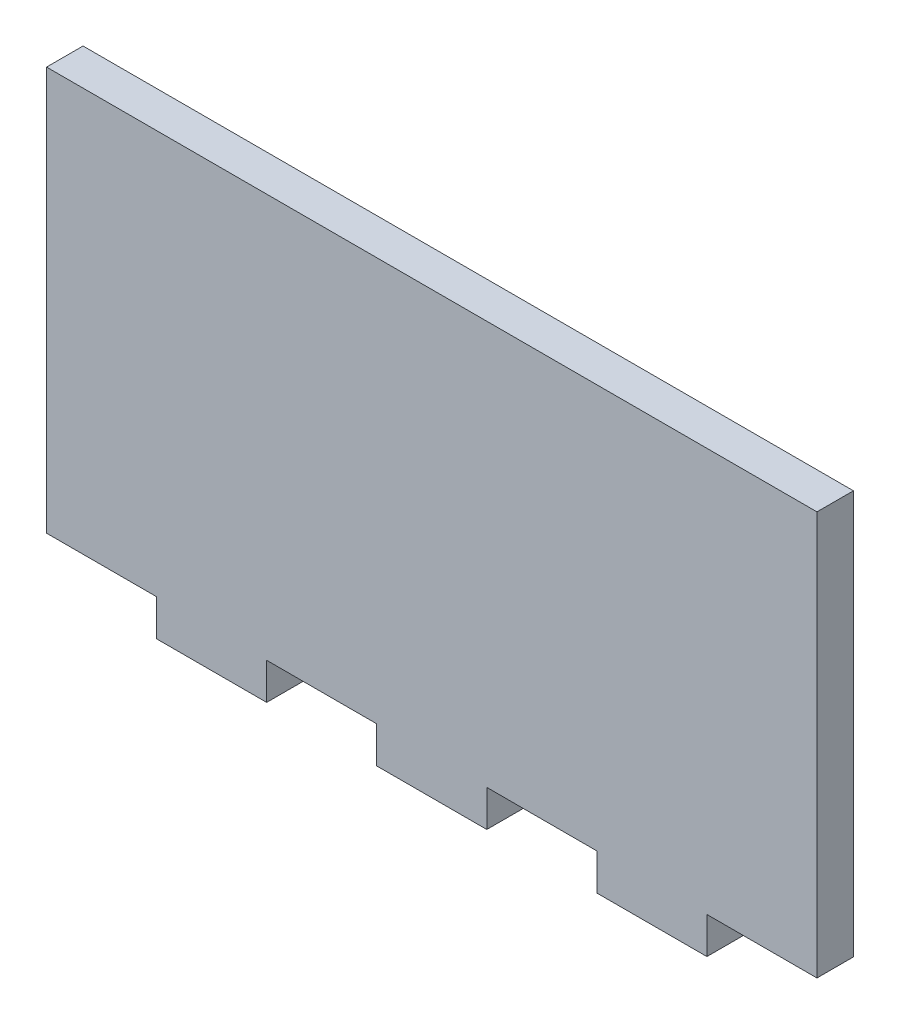
ISO-10303-21;
HEADER;
FILE_DESCRIPTION(('STEP AP214'),'2;1');
FILE_NAME('part.step','',(''),(''),'','','');
FILE_SCHEMA(('AUTOMOTIVE_DESIGN { 1 0 10303 214 1 1 1 1 }'));
ENDSEC;
DATA;
#1=APPLICATION_CONTEXT('core data for automotive mechanical design processes');
#2=APPLICATION_PROTOCOL_DEFINITION('international standard','automotive_design',2000,#1);
#3=PRODUCT_CONTEXT('',#1,'mechanical');
#4=PRODUCT('Part','Part','',(#3));
#5=PRODUCT_RELATED_PRODUCT_CATEGORY('part','',(#4));
#6=PRODUCT_DEFINITION_FORMATION('','',#4);
#7=PRODUCT_DEFINITION_CONTEXT('part definition',#1,'design');
#8=PRODUCT_DEFINITION('design','',#6,#7);
#9=PRODUCT_DEFINITION_SHAPE('','',#8);
#10=(LENGTH_UNIT() NAMED_UNIT(*) SI_UNIT(.MILLI.,.METRE.));
#11=(NAMED_UNIT(*) PLANE_ANGLE_UNIT() SI_UNIT($,.RADIAN.));
#12=(NAMED_UNIT(*) SI_UNIT($,.STERADIAN.) SOLID_ANGLE_UNIT());
#13=UNCERTAINTY_MEASURE_WITH_UNIT(LENGTH_MEASURE(1.E-05),#10,'distance_accuracy_value','');
#14=(GEOMETRIC_REPRESENTATION_CONTEXT(3) GLOBAL_UNCERTAINTY_ASSIGNED_CONTEXT((#13)) GLOBAL_UNIT_ASSIGNED_CONTEXT((#10,
#11,#12)) REPRESENTATION_CONTEXT('',''));
#15=CARTESIAN_POINT('',(0.,0.,0.));
#16=DIRECTION('',(0.,0.,1.));
#17=DIRECTION('',(1.,0.,0.));
#18=AXIS2_PLACEMENT_3D('',#15,#16,#17);
#19=CARTESIAN_POINT('',(0.,0.,3.175));
#20=DIRECTION('',(0.,1.,0.));
#21=DIRECTION('',(-1.,0.,0.));
#22=AXIS2_PLACEMENT_3D('',#19,#20,#21);
#23=PLANE('',#22);
#24=DIRECTION('',(0.,0.,1.));
#25=VECTOR('',#24,1.);
#26=CARTESIAN_POINT('',(-9.57942857142856,0.,0.));
#27=LINE('',#26,#25);
#28=CARTESIAN_POINT('',(-9.57942857142856,0.,0.));
#29=VERTEX_POINT('',#28);
#30=CARTESIAN_POINT('',(-9.57942857142856,0.,3.175));
#31=VERTEX_POINT('',#30);
#32=EDGE_CURVE('E161',#29,#31,#27,.T.);
#33=ORIENTED_EDGE('',*,*,#32,.F.);
#34=DIRECTION('',(1.,0.,0.));
#35=VECTOR('',#34,1.);
#36=CARTESIAN_POINT('',(0.,0.,0.));
#37=LINE('',#36,#35);
#38=CARTESIAN_POINT('',(0.,0.,0.));
#39=VERTEX_POINT('',#38);
#40=EDGE_CURVE('E148',#29,#39,#37,.T.);
#41=ORIENTED_EDGE('',*,*,#40,.T.);
#42=DIRECTION('',(0.,0.,-1.));
#43=VECTOR('',#42,1.);
#44=CARTESIAN_POINT('',(0.,0.,3.175));
#45=LINE('',#44,#43);
#46=CARTESIAN_POINT('',(0.,0.,3.175));
#47=VERTEX_POINT('',#46);
#48=EDGE_CURVE('E248',#47,#39,#45,.T.);
#49=ORIENTED_EDGE('',*,*,#48,.F.);
#50=DIRECTION('',(1.,0.,0.));
#51=VECTOR('',#50,1.);
#52=CARTESIAN_POINT('',(0.,0.,3.175));
#53=LINE('',#52,#51);
#54=EDGE_CURVE('E50',#31,#47,#53,.T.);
#55=ORIENTED_EDGE('',*,*,#54,.F.);
#56=EDGE_LOOP('',(#33,#41,#49,#55));
#57=FACE_BOUND('',#56,.T.);
#58=ADVANCED_FACE('F35',(#57),#23,.F.);
#59=DIRECTION('',(0.,0.,1.));
#60=VECTOR('',#59,1.);
#61=CARTESIAN_POINT('',(-19.1588571428571,0.,0.));
#62=LINE('',#61,#60);
#63=CARTESIAN_POINT('',(-19.1588571428571,0.,0.));
#64=VERTEX_POINT('',#63);
#65=CARTESIAN_POINT('',(-19.1588571428571,0.,3.175));
#66=VERTEX_POINT('',#65);
#67=EDGE_CURVE('E58',#64,#66,#62,.T.);
#68=ORIENTED_EDGE('',*,*,#67,.T.);
#69=CARTESIAN_POINT('',(-28.7382857142857,0.,3.175));
#70=VERTEX_POINT('',#69);
#71=EDGE_CURVE('E451',#70,#66,#53,.T.);
#72=ORIENTED_EDGE('',*,*,#71,.F.);
#73=DIRECTION('',(0.,0.,1.));
#74=VECTOR('',#73,1.);
#75=CARTESIAN_POINT('',(-28.7382857142857,0.,0.));
#76=LINE('',#75,#74);
#77=CARTESIAN_POINT('',(-28.7382857142857,0.,0.));
#78=VERTEX_POINT('',#77);
#79=EDGE_CURVE('E198',#78,#70,#76,.T.);
#80=ORIENTED_EDGE('',*,*,#79,.F.);
#81=EDGE_CURVE('E157',#78,#64,#37,.T.);
#82=ORIENTED_EDGE('',*,*,#81,.T.);
#83=EDGE_LOOP('',(#68,#72,#80,#82));
#84=FACE_BOUND('',#83,.T.);
#85=ADVANCED_FACE('F288',(#84),#23,.F.);
#86=DIRECTION('',(0.,0.,1.));
#87=VECTOR('',#86,1.);
#88=CARTESIAN_POINT('',(-38.3177142857143,0.,0.));
#89=LINE('',#88,#87);
#90=CARTESIAN_POINT('',(-38.3177142857143,0.,0.));
#91=VERTEX_POINT('',#90);
#92=CARTESIAN_POINT('',(-38.3177142857143,0.,3.175));
#93=VERTEX_POINT('',#92);
#94=EDGE_CURVE('E211',#91,#93,#89,.T.);
#95=ORIENTED_EDGE('',*,*,#94,.T.);
#96=CARTESIAN_POINT('',(-47.8971428571428,0.,3.175));
#97=VERTEX_POINT('',#96);
#98=EDGE_CURVE('E249',#97,#93,#53,.T.);
#99=ORIENTED_EDGE('',*,*,#98,.F.);
#100=DIRECTION('',(0.,0.,1.));
#101=VECTOR('',#100,1.);
#102=CARTESIAN_POINT('',(-47.8971428571428,0.,0.));
#103=LINE('',#102,#101);
#104=CARTESIAN_POINT('',(-47.8971428571428,0.,0.));
#105=VERTEX_POINT('',#104);
#106=EDGE_CURVE('E223',#105,#97,#103,.T.);
#107=ORIENTED_EDGE('',*,*,#106,.F.);
#108=EDGE_CURVE('E255',#105,#91,#37,.T.);
#109=ORIENTED_EDGE('',*,*,#108,.T.);
#110=EDGE_LOOP('',(#95,#99,#107,#109));
#111=FACE_BOUND('',#110,.T.);
#112=ADVANCED_FACE('F283',(#111),#23,.F.);
#113=CARTESIAN_POINT('',(0.,0.,3.175));
#114=DIRECTION('',(-1.,0.,0.));
#115=DIRECTION('',(0.,0.,1.));
#116=AXIS2_PLACEMENT_3D('',#113,#114,#115);
#117=PLANE('',#116);
#118=DIRECTION('',(0.,1.,0.));
#119=VECTOR('',#118,1.);
#120=CARTESIAN_POINT('',(0.,0.,0.));
#121=LINE('',#120,#119);
#122=CARTESIAN_POINT('',(0.,35.13836,0.));
#123=VERTEX_POINT('',#122);
#124=EDGE_CURVE('E155',#39,#123,#121,.T.);
#125=ORIENTED_EDGE('',*,*,#124,.T.);
#126=DIRECTION('',(0.,0.,-1.));
#127=VECTOR('',#126,1.);
#128=CARTESIAN_POINT('',(0.,35.13836,3.175));
#129=LINE('',#128,#127);
#130=CARTESIAN_POINT('',(0.,35.13836,3.175));
#131=VERTEX_POINT('',#130);
#132=EDGE_CURVE('E11',#131,#123,#129,.T.);
#133=ORIENTED_EDGE('',*,*,#132,.F.);
#134=DIRECTION('',(0.,1.,0.));
#135=VECTOR('',#134,1.);
#136=CARTESIAN_POINT('',(0.,0.,3.175));
#137=LINE('',#136,#135);
#138=EDGE_CURVE('E238',#47,#131,#137,.T.);
#139=ORIENTED_EDGE('',*,*,#138,.F.);
#140=ORIENTED_EDGE('',*,*,#48,.T.);
#141=EDGE_LOOP('',(#125,#133,#139,#140));
#142=FACE_BOUND('',#141,.T.);
#143=ADVANCED_FACE('F37',(#142),#117,.F.);
#144=CARTESIAN_POINT('',(0.,35.13836,3.175));
#145=DIRECTION('',(0.,-1.,0.));
#146=DIRECTION('',(1.,0.,0.));
#147=AXIS2_PLACEMENT_3D('',#144,#145,#146);
#148=PLANE('',#147);
#149=DIRECTION('',(-1.,0.,0.));
#150=VECTOR('',#149,1.);
#151=CARTESIAN_POINT('',(0.,35.13836,0.));
#152=LINE('',#151,#150);
#153=CARTESIAN_POINT('',(-67.056,35.13836,0.));
#154=VERTEX_POINT('',#153);
#155=EDGE_CURVE('E251',#123,#154,#152,.T.);
#156=ORIENTED_EDGE('',*,*,#155,.T.);
#157=DIRECTION('',(0.,0.,-1.));
#158=VECTOR('',#157,1.);
#159=CARTESIAN_POINT('',(-67.056,35.13836,3.175));
#160=LINE('',#159,#158);
#161=CARTESIAN_POINT('',(-67.056,35.13836,3.175));
#162=VERTEX_POINT('',#161);
#163=EDGE_CURVE('E43',#162,#154,#160,.T.);
#164=ORIENTED_EDGE('',*,*,#163,.F.);
#165=DIRECTION('',(-1.,0.,0.));
#166=VECTOR('',#165,1.);
#167=CARTESIAN_POINT('',(0.,35.13836,3.175));
#168=LINE('',#167,#166);
#169=EDGE_CURVE('E241',#131,#162,#168,.T.);
#170=ORIENTED_EDGE('',*,*,#169,.F.);
#171=ORIENTED_EDGE('',*,*,#132,.T.);
#172=EDGE_LOOP('',(#156,#164,#170,#171));
#173=FACE_BOUND('',#172,.T.);
#174=ADVANCED_FACE('F280',(#173),#148,.F.);
#175=CARTESIAN_POINT('',(-67.056,0.,3.175));
#176=DIRECTION('',(1.,0.,0.));
#177=DIRECTION('',(0.,0.,-1.));
#178=AXIS2_PLACEMENT_3D('',#175,#176,#177);
#179=PLANE('',#178);
#180=DIRECTION('',(0.,-1.,0.));
#181=VECTOR('',#180,1.);
#182=CARTESIAN_POINT('',(-67.056,0.,0.));
#183=LINE('',#182,#181);
#184=CARTESIAN_POINT('',(-67.056,0.,0.));
#185=VERTEX_POINT('',#184);
#186=EDGE_CURVE('E158',#154,#185,#183,.T.);
#187=ORIENTED_EDGE('',*,*,#186,.T.);
#188=DIRECTION('',(0.,0.,-1.));
#189=VECTOR('',#188,1.);
#190=CARTESIAN_POINT('',(-67.056,0.,3.175));
#191=LINE('',#190,#189);
#192=CARTESIAN_POINT('',(-67.056,0.,3.175));
#193=VERTEX_POINT('',#192);
#194=EDGE_CURVE('E257',#193,#185,#191,.T.);
#195=ORIENTED_EDGE('',*,*,#194,.F.);
#196=DIRECTION('',(0.,-1.,0.));
#197=VECTOR('',#196,1.);
#198=CARTESIAN_POINT('',(-67.056,0.,3.175));
#199=LINE('',#198,#197);
#200=EDGE_CURVE('E243',#162,#193,#199,.T.);
#201=ORIENTED_EDGE('',*,*,#200,.F.);
#202=ORIENTED_EDGE('',*,*,#163,.T.);
#203=EDGE_LOOP('',(#187,#195,#201,#202));
#204=FACE_BOUND('',#203,.T.);
#205=ADVANCED_FACE('F264',(#204),#179,.F.);
#206=CARTESIAN_POINT('',(-57.4765714285714,0.,0.));
#207=VERTEX_POINT('',#206);
#208=EDGE_CURVE('E160',#185,#207,#37,.T.);
#209=ORIENTED_EDGE('',*,*,#208,.T.);
#210=DIRECTION('',(0.,0.,1.));
#211=VECTOR('',#210,1.);
#212=CARTESIAN_POINT('',(-57.4765714285714,0.,0.));
#213=LINE('',#212,#211);
#214=CARTESIAN_POINT('',(-57.4765714285714,0.,3.175));
#215=VERTEX_POINT('',#214);
#216=EDGE_CURVE('E234',#207,#215,#213,.T.);
#217=ORIENTED_EDGE('',*,*,#216,.T.);
#218=EDGE_CURVE('E245',#193,#215,#53,.T.);
#219=ORIENTED_EDGE('',*,*,#218,.F.);
#220=ORIENTED_EDGE('',*,*,#194,.T.);
#221=EDGE_LOOP('',(#209,#217,#219,#220));
#222=FACE_BOUND('',#221,.T.);
#223=ADVANCED_FACE('F272',(#222),#23,.F.);
#224=CARTESIAN_POINT('',(0.,0.,3.175));
#225=DIRECTION('',(0.,0.,1.));
#226=DIRECTION('',(1.,0.,0.));
#227=AXIS2_PLACEMENT_3D('',#224,#225,#226);
#228=PLANE('',#227);
#229=ORIENTED_EDGE('',*,*,#138,.T.);
#230=ORIENTED_EDGE('',*,*,#169,.T.);
#231=ORIENTED_EDGE('',*,*,#200,.T.);
#232=ORIENTED_EDGE('',*,*,#218,.T.);
#233=DIRECTION('',(0.,1.,0.));
#234=VECTOR('',#233,1.);
#235=CARTESIAN_POINT('',(-57.4765714285714,0.,3.175));
#236=LINE('',#235,#234);
#237=CARTESIAN_POINT('',(-57.4765714285714,-3.175,3.175));
#238=VERTEX_POINT('',#237);
#239=EDGE_CURVE('E226',#238,#215,#236,.T.);
#240=ORIENTED_EDGE('',*,*,#239,.F.);
#241=DIRECTION('',(1.,0.,0.));
#242=VECTOR('',#241,1.);
#243=CARTESIAN_POINT('',(0.,-3.17499999999999,3.175));
#244=LINE('',#243,#242);
#245=CARTESIAN_POINT('',(-47.8971428571428,-3.175,3.175));
#246=VERTEX_POINT('',#245);
#247=EDGE_CURVE('E218',#238,#246,#244,.T.);
#248=ORIENTED_EDGE('',*,*,#247,.T.);
#249=DIRECTION('',(0.,-1.,0.));
#250=VECTOR('',#249,1.);
#251=CARTESIAN_POINT('',(-47.8971428571428,0.,3.175));
#252=LINE('',#251,#250);
#253=EDGE_CURVE('E208',#97,#246,#252,.T.);
#254=ORIENTED_EDGE('',*,*,#253,.F.);
#255=ORIENTED_EDGE('',*,*,#98,.T.);
#256=DIRECTION('',(0.,1.,0.));
#257=VECTOR('',#256,1.);
#258=CARTESIAN_POINT('',(-38.3177142857143,0.,3.175));
#259=LINE('',#258,#257);
#260=CARTESIAN_POINT('',(-38.3177142857143,-3.175,3.175));
#261=VERTEX_POINT('',#260);
#262=EDGE_CURVE('E201',#261,#93,#259,.T.);
#263=ORIENTED_EDGE('',*,*,#262,.F.);
#264=DIRECTION('',(1.,0.,0.));
#265=VECTOR('',#264,1.);
#266=CARTESIAN_POINT('',(19.1588571428571,-3.17499999999999,3.175));
#267=LINE('',#266,#265);
#268=CARTESIAN_POINT('',(-28.7382857142857,-3.175,3.175));
#269=VERTEX_POINT('',#268);
#270=EDGE_CURVE('E192',#261,#269,#267,.T.);
#271=ORIENTED_EDGE('',*,*,#270,.T.);
#272=DIRECTION('',(0.,-1.,0.));
#273=VECTOR('',#272,1.);
#274=CARTESIAN_POINT('',(-28.7382857142857,0.,3.175));
#275=LINE('',#274,#273);
#276=EDGE_CURVE('E185',#70,#269,#275,.T.);
#277=ORIENTED_EDGE('',*,*,#276,.F.);
#278=ORIENTED_EDGE('',*,*,#71,.T.);
#279=DIRECTION('',(0.,1.,0.));
#280=VECTOR('',#279,1.);
#281=CARTESIAN_POINT('',(-19.1588571428571,0.,3.175));
#282=LINE('',#281,#280);
#283=CARTESIAN_POINT('',(-19.1588571428571,-3.175,3.175));
#284=VERTEX_POINT('',#283);
#285=EDGE_CURVE('E176',#284,#66,#282,.T.);
#286=ORIENTED_EDGE('',*,*,#285,.F.);
#287=DIRECTION('',(1.,0.,0.));
#288=VECTOR('',#287,1.);
#289=CARTESIAN_POINT('',(38.3177142857143,-3.17499999999999,3.175));
#290=LINE('',#289,#288);
#291=CARTESIAN_POINT('',(-9.57942857142856,-3.175,3.175));
#292=VERTEX_POINT('',#291);
#293=EDGE_CURVE('E171',#284,#292,#290,.T.);
#294=ORIENTED_EDGE('',*,*,#293,.T.);
#295=DIRECTION('',(0.,-1.,0.));
#296=VECTOR('',#295,1.);
#297=CARTESIAN_POINT('',(-9.57942857142856,0.,3.175));
#298=LINE('',#297,#296);
#299=EDGE_CURVE('E180',#31,#292,#298,.T.);
#300=ORIENTED_EDGE('',*,*,#299,.F.);
#301=ORIENTED_EDGE('',*,*,#54,.T.);
#302=EDGE_LOOP('',(#229,#230,#231,#232,#240,#248,#254,#255,#263,#271,#277,#278,#286,#294,#300,#301));
#303=FACE_BOUND('',#302,.T.);
#304=ADVANCED_FACE('F276',(#303),#228,.T.);
#305=CARTESIAN_POINT('',(0.,0.,0.));
#306=DIRECTION('',(0.,0.,1.));
#307=DIRECTION('',(1.,0.,0.));
#308=AXIS2_PLACEMENT_3D('',#305,#306,#307);
#309=PLANE('',#308);
#310=ORIENTED_EDGE('',*,*,#124,.F.);
#311=ORIENTED_EDGE('',*,*,#40,.F.);
#312=DIRECTION('',(0.,-1.,0.));
#313=VECTOR('',#312,1.);
#314=CARTESIAN_POINT('',(-9.57942857142856,0.,0.));
#315=LINE('',#314,#313);
#316=CARTESIAN_POINT('',(-9.57942857142856,-3.175,0.));
#317=VERTEX_POINT('',#316);
#318=EDGE_CURVE('E152',#29,#317,#315,.T.);
#319=ORIENTED_EDGE('',*,*,#318,.T.);
#320=DIRECTION('',(1.,0.,0.));
#321=VECTOR('',#320,1.);
#322=CARTESIAN_POINT('',(38.3177142857143,-3.17499999999999,0.));
#323=LINE('',#322,#321);
#324=CARTESIAN_POINT('',(-19.1588571428571,-3.175,0.));
#325=VERTEX_POINT('',#324);
#326=EDGE_CURVE('E165',#325,#317,#323,.T.);
#327=ORIENTED_EDGE('',*,*,#326,.F.);
#328=DIRECTION('',(0.,1.,0.));
#329=VECTOR('',#328,1.);
#330=CARTESIAN_POINT('',(-19.1588571428571,0.,0.));
#331=LINE('',#330,#329);
#332=EDGE_CURVE('E170',#325,#64,#331,.T.);
#333=ORIENTED_EDGE('',*,*,#332,.T.);
#334=ORIENTED_EDGE('',*,*,#81,.F.);
#335=DIRECTION('',(0.,-1.,0.));
#336=VECTOR('',#335,1.);
#337=CARTESIAN_POINT('',(-28.7382857142857,0.,0.));
#338=LINE('',#337,#336);
#339=CARTESIAN_POINT('',(-28.7382857142857,-3.175,0.));
#340=VERTEX_POINT('',#339);
#341=EDGE_CURVE('E189',#78,#340,#338,.T.);
#342=ORIENTED_EDGE('',*,*,#341,.T.);
#343=DIRECTION('',(1.,0.,0.));
#344=VECTOR('',#343,1.);
#345=CARTESIAN_POINT('',(19.1588571428571,-3.17499999999999,0.));
#346=LINE('',#345,#344);
#347=CARTESIAN_POINT('',(-38.3177142857143,-3.175,0.));
#348=VERTEX_POINT('',#347);
#349=EDGE_CURVE('E195',#348,#340,#346,.T.);
#350=ORIENTED_EDGE('',*,*,#349,.F.);
#351=DIRECTION('',(0.,1.,0.));
#352=VECTOR('',#351,1.);
#353=CARTESIAN_POINT('',(-38.3177142857143,0.,0.));
#354=LINE('',#353,#352);
#355=EDGE_CURVE('E191',#348,#91,#354,.T.);
#356=ORIENTED_EDGE('',*,*,#355,.T.);
#357=ORIENTED_EDGE('',*,*,#108,.F.);
#358=DIRECTION('',(0.,-1.,0.));
#359=VECTOR('',#358,1.);
#360=CARTESIAN_POINT('',(-47.8971428571428,0.,0.));
#361=LINE('',#360,#359);
#362=CARTESIAN_POINT('',(-47.8971428571428,-3.175,0.));
#363=VERTEX_POINT('',#362);
#364=EDGE_CURVE('E215',#105,#363,#361,.T.);
#365=ORIENTED_EDGE('',*,*,#364,.T.);
#366=DIRECTION('',(1.,0.,0.));
#367=VECTOR('',#366,1.);
#368=CARTESIAN_POINT('',(0.,-3.17499999999999,0.));
#369=LINE('',#368,#367);
#370=CARTESIAN_POINT('',(-57.4765714285714,-3.175,0.));
#371=VERTEX_POINT('',#370);
#372=EDGE_CURVE('E220',#371,#363,#369,.T.);
#373=ORIENTED_EDGE('',*,*,#372,.F.);
#374=DIRECTION('',(0.,1.,0.));
#375=VECTOR('',#374,1.);
#376=CARTESIAN_POINT('',(-57.4765714285714,0.,0.));
#377=LINE('',#376,#375);
#378=EDGE_CURVE('E217',#371,#207,#377,.T.);
#379=ORIENTED_EDGE('',*,*,#378,.T.);
#380=ORIENTED_EDGE('',*,*,#208,.F.);
#381=ORIENTED_EDGE('',*,*,#186,.F.);
#382=ORIENTED_EDGE('',*,*,#155,.F.);
#383=EDGE_LOOP('',(#310,#311,#319,#327,#333,#334,#342,#350,#356,#357,#365,#373,#379,#380,#381,#382));
#384=FACE_BOUND('',#383,.T.);
#385=ADVANCED_FACE('F149',(#384),#309,.F.);
#386=CARTESIAN_POINT('',(-47.8971428571428,0.,0.));
#387=DIRECTION('',(-1.,0.,0.));
#388=DIRECTION('',(0.,0.,1.));
#389=AXIS2_PLACEMENT_3D('',#386,#387,#388);
#390=PLANE('',#389);
#391=ORIENTED_EDGE('',*,*,#253,.T.);
#392=DIRECTION('',(0.,0.,1.));
#393=VECTOR('',#392,1.);
#394=CARTESIAN_POINT('',(-47.8971428571428,-3.175,0.));
#395=LINE('',#394,#393);
#396=EDGE_CURVE('E230',#363,#246,#395,.T.);
#397=ORIENTED_EDGE('',*,*,#396,.F.);
#398=ORIENTED_EDGE('',*,*,#364,.F.);
#399=ORIENTED_EDGE('',*,*,#106,.T.);
#400=EDGE_LOOP('',(#391,#397,#398,#399));
#401=FACE_BOUND('',#400,.T.);
#402=ADVANCED_FACE('F336',(#401),#390,.F.);
#403=CARTESIAN_POINT('',(0.,-3.17499999999999,0.));
#404=DIRECTION('',(0.,-1.,0.));
#405=DIRECTION('',(1.,0.,0.));
#406=AXIS2_PLACEMENT_3D('',#403,#404,#405);
#407=PLANE('',#406);
#408=ORIENTED_EDGE('',*,*,#247,.F.);
#409=DIRECTION('',(0.,0.,1.));
#410=VECTOR('',#409,1.);
#411=CARTESIAN_POINT('',(-57.4765714285714,-3.175,0.));
#412=LINE('',#411,#410);
#413=EDGE_CURVE('E232',#371,#238,#412,.T.);
#414=ORIENTED_EDGE('',*,*,#413,.F.);
#415=ORIENTED_EDGE('',*,*,#372,.T.);
#416=ORIENTED_EDGE('',*,*,#396,.T.);
#417=EDGE_LOOP('',(#408,#414,#415,#416));
#418=FACE_BOUND('',#417,.T.);
#419=ADVANCED_FACE('F349',(#418),#407,.T.);
#420=CARTESIAN_POINT('',(-57.4765714285714,0.,0.));
#421=DIRECTION('',(1.,0.,0.));
#422=DIRECTION('',(0.,0.,-1.));
#423=AXIS2_PLACEMENT_3D('',#420,#421,#422);
#424=PLANE('',#423);
#425=ORIENTED_EDGE('',*,*,#239,.T.);
#426=ORIENTED_EDGE('',*,*,#216,.F.);
#427=ORIENTED_EDGE('',*,*,#378,.F.);
#428=ORIENTED_EDGE('',*,*,#413,.T.);
#429=EDGE_LOOP('',(#425,#426,#427,#428));
#430=FACE_BOUND('',#429,.T.);
#431=ADVANCED_FACE('F358',(#430),#424,.F.);
#432=CARTESIAN_POINT('',(-28.7382857142857,0.,0.));
#433=DIRECTION('',(-1.,0.,0.));
#434=DIRECTION('',(0.,0.,1.));
#435=AXIS2_PLACEMENT_3D('',#432,#433,#434);
#436=PLANE('',#435);
#437=ORIENTED_EDGE('',*,*,#276,.T.);
#438=DIRECTION('',(0.,0.,1.));
#439=VECTOR('',#438,1.);
#440=CARTESIAN_POINT('',(-28.7382857142857,-3.175,0.));
#441=LINE('',#440,#439);
#442=EDGE_CURVE('E206',#340,#269,#441,.T.);
#443=ORIENTED_EDGE('',*,*,#442,.F.);
#444=ORIENTED_EDGE('',*,*,#341,.F.);
#445=ORIENTED_EDGE('',*,*,#79,.T.);
#446=EDGE_LOOP('',(#437,#443,#444,#445));
#447=FACE_BOUND('',#446,.T.);
#448=ADVANCED_FACE('F367',(#447),#436,.F.);
#449=CARTESIAN_POINT('',(19.1588571428571,-3.17499999999999,0.));
#450=DIRECTION('',(0.,-1.,0.));
#451=DIRECTION('',(1.,0.,0.));
#452=AXIS2_PLACEMENT_3D('',#449,#450,#451);
#453=PLANE('',#452);
#454=ORIENTED_EDGE('',*,*,#270,.F.);
#455=DIRECTION('',(0.,0.,1.));
#456=VECTOR('',#455,1.);
#457=CARTESIAN_POINT('',(-38.3177142857143,-3.175,0.));
#458=LINE('',#457,#456);
#459=EDGE_CURVE('E209',#348,#261,#458,.T.);
#460=ORIENTED_EDGE('',*,*,#459,.F.);
#461=ORIENTED_EDGE('',*,*,#349,.T.);
#462=ORIENTED_EDGE('',*,*,#442,.T.);
#463=EDGE_LOOP('',(#454,#460,#461,#462));
#464=FACE_BOUND('',#463,.T.);
#465=ADVANCED_FACE('F395',(#464),#453,.T.);
#466=CARTESIAN_POINT('',(-38.3177142857143,0.,0.));
#467=DIRECTION('',(1.,0.,0.));
#468=DIRECTION('',(0.,0.,-1.));
#469=AXIS2_PLACEMENT_3D('',#466,#467,#468);
#470=PLANE('',#469);
#471=ORIENTED_EDGE('',*,*,#262,.T.);
#472=ORIENTED_EDGE('',*,*,#94,.F.);
#473=ORIENTED_EDGE('',*,*,#355,.F.);
#474=ORIENTED_EDGE('',*,*,#459,.T.);
#475=EDGE_LOOP('',(#471,#472,#473,#474));
#476=FACE_BOUND('',#475,.T.);
#477=ADVANCED_FACE('F405',(#476),#470,.F.);
#478=CARTESIAN_POINT('',(-9.57942857142856,0.,0.));
#479=DIRECTION('',(-1.,0.,0.));
#480=DIRECTION('',(0.,0.,1.));
#481=AXIS2_PLACEMENT_3D('',#478,#479,#480);
#482=PLANE('',#481);
#483=ORIENTED_EDGE('',*,*,#299,.T.);
#484=DIRECTION('',(0.,0.,1.));
#485=VECTOR('',#484,1.);
#486=CARTESIAN_POINT('',(-9.57942857142856,-3.175,0.));
#487=LINE('',#486,#485);
#488=EDGE_CURVE('E168',#317,#292,#487,.T.);
#489=ORIENTED_EDGE('',*,*,#488,.F.);
#490=ORIENTED_EDGE('',*,*,#318,.F.);
#491=ORIENTED_EDGE('',*,*,#32,.T.);
#492=EDGE_LOOP('',(#483,#489,#490,#491));
#493=FACE_BOUND('',#492,.T.);
#494=ADVANCED_FACE('F167',(#493),#482,.F.);
#495=CARTESIAN_POINT('',(38.3177142857143,-3.17499999999999,0.));
#496=DIRECTION('',(0.,-1.,0.));
#497=DIRECTION('',(1.,0.,0.));
#498=AXIS2_PLACEMENT_3D('',#495,#496,#497);
#499=PLANE('',#498);
#500=ORIENTED_EDGE('',*,*,#293,.F.);
#501=DIRECTION('',(0.,0.,1.));
#502=VECTOR('',#501,1.);
#503=CARTESIAN_POINT('',(-19.1588571428571,-3.175,0.));
#504=LINE('',#503,#502);
#505=EDGE_CURVE('E186',#325,#284,#504,.T.);
#506=ORIENTED_EDGE('',*,*,#505,.F.);
#507=ORIENTED_EDGE('',*,*,#326,.T.);
#508=ORIENTED_EDGE('',*,*,#488,.T.);
#509=EDGE_LOOP('',(#500,#506,#507,#508));
#510=FACE_BOUND('',#509,.T.);
#511=ADVANCED_FACE('F424',(#510),#499,.T.);
#512=CARTESIAN_POINT('',(-19.1588571428571,0.,0.));
#513=DIRECTION('',(1.,0.,0.));
#514=DIRECTION('',(0.,0.,-1.));
#515=AXIS2_PLACEMENT_3D('',#512,#513,#514);
#516=PLANE('',#515);
#517=ORIENTED_EDGE('',*,*,#285,.T.);
#518=ORIENTED_EDGE('',*,*,#67,.F.);
#519=ORIENTED_EDGE('',*,*,#332,.F.);
#520=ORIENTED_EDGE('',*,*,#505,.T.);
#521=EDGE_LOOP('',(#517,#518,#519,#520));
#522=FACE_BOUND('',#521,.T.);
#523=ADVANCED_FACE('F433',(#522),#516,.F.);
#524=CLOSED_SHELL('',(#58,#85,#112,#143,#174,#205,#223,#304,#385,#402,#419,#431,#448,#465,#477,
#494,#511,#523));
#525=MANIFOLD_SOLID_BREP('B2',#524);
#526=ADVANCED_BREP_SHAPE_REPRESENTATION('',(#18,#525),#14);
#527=SHAPE_DEFINITION_REPRESENTATION(#9,#526);
ENDSEC;
END-ISO-10303-21;
